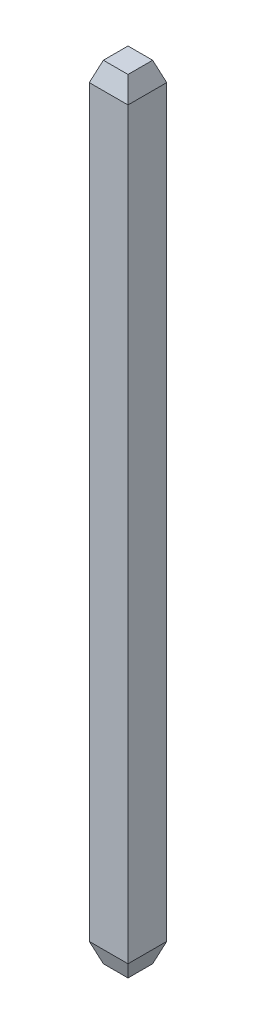
ISO-10303-21;
HEADER;
FILE_DESCRIPTION(('STEP AP214'),'2;1');
FILE_NAME('part.step','',(''),(''),'','','');
FILE_SCHEMA(('AUTOMOTIVE_DESIGN { 1 0 10303 214 1 1 1 1 }'));
ENDSEC;
DATA;
#1=APPLICATION_CONTEXT('core data for automotive mechanical design processes');
#2=APPLICATION_PROTOCOL_DEFINITION('international standard','automotive_design',2000,#1);
#3=PRODUCT_CONTEXT('',#1,'mechanical');
#4=PRODUCT('Part','Part','',(#3));
#5=PRODUCT_RELATED_PRODUCT_CATEGORY('part','',(#4));
#6=PRODUCT_DEFINITION_FORMATION('','',#4);
#7=PRODUCT_DEFINITION_CONTEXT('part definition',#1,'design');
#8=PRODUCT_DEFINITION('design','',#6,#7);
#9=PRODUCT_DEFINITION_SHAPE('','',#8);
#10=(LENGTH_UNIT() NAMED_UNIT(*) SI_UNIT(.MILLI.,.METRE.));
#11=(NAMED_UNIT(*) PLANE_ANGLE_UNIT() SI_UNIT($,.RADIAN.));
#12=(NAMED_UNIT(*) SI_UNIT($,.STERADIAN.) SOLID_ANGLE_UNIT());
#13=UNCERTAINTY_MEASURE_WITH_UNIT(LENGTH_MEASURE(1.E-05),#10,'distance_accuracy_value','');
#14=(GEOMETRIC_REPRESENTATION_CONTEXT(3) GLOBAL_UNCERTAINTY_ASSIGNED_CONTEXT((#13)) GLOBAL_UNIT_ASSIGNED_CONTEXT((#10,
#11,#12)) REPRESENTATION_CONTEXT('',''));
#15=CARTESIAN_POINT('',(0.,0.,0.));
#16=DIRECTION('',(0.,0.,1.));
#17=DIRECTION('',(1.,0.,0.));
#18=AXIS2_PLACEMENT_3D('',#15,#16,#17);
#19=CARTESIAN_POINT('',(12.7,4.1,-7.37));
#20=DIRECTION('',(0.,0.,-1.));
#21=DIRECTION('',(0.,-1.,0.));
#22=AXIS2_PLACEMENT_3D('',#19,#20,#21);
#23=PLANE('',#22);
#24=DIRECTION('',(-1.,0.,0.));
#25=VECTOR('',#24,1.);
#26=CARTESIAN_POINT('',(12.7,-5.75,-7.37));
#27=LINE('',#26,#25);
#28=CARTESIAN_POINT('',(-4.83,-5.75,-7.37));
#29=VERTEX_POINT('',#28);
#30=CARTESIAN_POINT('',(-5.33,-5.75,-7.37));
#31=VERTEX_POINT('',#30);
#32=EDGE_CURVE('E11',#29,#31,#27,.T.);
#33=ORIENTED_EDGE('',*,*,#32,.F.);
#34=DIRECTION('',(0.,-1.,0.));
#35=VECTOR('',#34,1.);
#36=CARTESIAN_POINT('',(-4.83,4.1,-7.37));
#37=LINE('',#36,#35);
#38=CARTESIAN_POINT('',(-4.83,3.85,-7.37));
#39=VERTEX_POINT('',#38);
#40=EDGE_CURVE('E24',#39,#29,#37,.T.);
#41=ORIENTED_EDGE('',*,*,#40,.F.);
#42=DIRECTION('',(1.,0.,0.));
#43=VECTOR('',#42,1.);
#44=CARTESIAN_POINT('',(12.7,3.85,-7.37));
#45=LINE('',#44,#43);
#46=CARTESIAN_POINT('',(-5.33,3.85,-7.37));
#47=VERTEX_POINT('',#46);
#48=EDGE_CURVE('E158',#47,#39,#45,.T.);
#49=ORIENTED_EDGE('',*,*,#48,.F.);
#50=DIRECTION('',(0.,1.,0.));
#51=VECTOR('',#50,1.);
#52=CARTESIAN_POINT('',(-5.33,4.1,-7.37));
#53=LINE('',#52,#51);
#54=EDGE_CURVE('E155',#31,#47,#53,.T.);
#55=ORIENTED_EDGE('',*,*,#54,.F.);
#56=EDGE_LOOP('',(#33,#41,#49,#55));
#57=FACE_BOUND('',#56,.T.);
#58=ADVANCED_FACE('F17',(#57),#23,.F.);
#59=CARTESIAN_POINT('',(-5.33,4.1,0.));
#60=DIRECTION('',(-1.,0.,0.));
#61=DIRECTION('',(0.,0.,1.));
#62=AXIS2_PLACEMENT_3D('',#59,#60,#61);
#63=PLANE('',#62);
#64=ORIENTED_EDGE('',*,*,#54,.T.);
#65=DIRECTION('',(0.,0.,-1.));
#66=VECTOR('',#65,1.);
#67=CARTESIAN_POINT('',(-5.33,3.85,0.));
#68=LINE('',#67,#66);
#69=CARTESIAN_POINT('',(-5.33,3.85,-7.87));
#70=VERTEX_POINT('',#69);
#71=EDGE_CURVE('E153',#47,#70,#68,.T.);
#72=ORIENTED_EDGE('',*,*,#71,.T.);
#73=DIRECTION('',(0.,-1.,0.));
#74=VECTOR('',#73,1.);
#75=CARTESIAN_POINT('',(-5.33,4.1,-7.87));
#76=LINE('',#75,#74);
#77=CARTESIAN_POINT('',(-5.33,-5.75,-7.87));
#78=VERTEX_POINT('',#77);
#79=EDGE_CURVE('E151',#70,#78,#76,.T.);
#80=ORIENTED_EDGE('',*,*,#79,.T.);
#81=DIRECTION('',(0.,0.,1.));
#82=VECTOR('',#81,1.);
#83=CARTESIAN_POINT('',(-5.33,-5.75,0.));
#84=LINE('',#83,#82);
#85=EDGE_CURVE('E148',#78,#31,#84,.T.);
#86=ORIENTED_EDGE('',*,*,#85,.T.);
#87=EDGE_LOOP('',(#64,#72,#80,#86));
#88=FACE_BOUND('',#87,.T.);
#89=ADVANCED_FACE('F182',(#88),#63,.T.);
#90=CARTESIAN_POINT('',(12.7,-6.,-7.46099255856655));
#91=DIRECTION('',(0.,0.342020143325665,-0.93969262078591));
#92=DIRECTION('',(-1.,0.,0.));
#93=AXIS2_PLACEMENT_3D('',#90,#91,#92);
#94=PLANE('',#93);
#95=DIRECTION('',(-1.,0.,0.));
#96=VECTOR('',#95,1.);
#97=CARTESIAN_POINT('',(12.7,-6.,-7.46099255856655));
#98=LINE('',#97,#96);
#99=CARTESIAN_POINT('',(-4.92099255856655,-6.,-7.46099255856655));
#100=VERTEX_POINT('',#99);
#101=CARTESIAN_POINT('',(-5.23900744143345,-6.,-7.46099255856655));
#102=VERTEX_POINT('',#101);
#103=EDGE_CURVE('E146',#100,#102,#98,.T.);
#104=ORIENTED_EDGE('',*,*,#103,.F.);
#105=DIRECTION('',(-0.323615577118173,-0.889126490715994,-0.323615577118182));
#106=VECTOR('',#105,1.);
#107=CARTESIAN_POINT('',(-4.83,-5.75,-7.37));
#108=LINE('',#107,#106);
#109=EDGE_CURVE('E143',#29,#100,#108,.T.);
#110=ORIENTED_EDGE('',*,*,#109,.F.);
#111=ORIENTED_EDGE('',*,*,#32,.T.);
#112=DIRECTION('',(-0.323615577118173,0.889126490715994,0.323615577118182));
#113=VECTOR('',#112,1.);
#114=CARTESIAN_POINT('',(-5.23900744143345,-6.,-7.46099255856655));
#115=LINE('',#114,#113);
#116=EDGE_CURVE('E140',#102,#31,#115,.T.);
#117=ORIENTED_EDGE('',*,*,#116,.F.);
#118=EDGE_LOOP('',(#104,#110,#111,#117));
#119=FACE_BOUND('',#118,.T.);
#120=ADVANCED_FACE('F162',(#119),#94,.F.);
#121=CARTESIAN_POINT('',(-4.83,4.1,0.));
#122=DIRECTION('',(-1.,0.,0.));
#123=DIRECTION('',(0.,0.,1.));
#124=AXIS2_PLACEMENT_3D('',#121,#122,#123);
#125=PLANE('',#124);
#126=DIRECTION('',(0.,0.,1.));
#127=VECTOR('',#126,1.);
#128=CARTESIAN_POINT('',(-4.83,-5.75,0.));
#129=LINE('',#128,#127);
#130=CARTESIAN_POINT('',(-4.83,-5.75,-7.87));
#131=VERTEX_POINT('',#130);
#132=EDGE_CURVE('E137',#131,#29,#129,.T.);
#133=ORIENTED_EDGE('',*,*,#132,.F.);
#134=DIRECTION('',(0.,-1.,0.));
#135=VECTOR('',#134,1.);
#136=CARTESIAN_POINT('',(-4.83,4.1,-7.87));
#137=LINE('',#136,#135);
#138=CARTESIAN_POINT('',(-4.83,3.85,-7.87));
#139=VERTEX_POINT('',#138);
#140=EDGE_CURVE('E134',#139,#131,#137,.T.);
#141=ORIENTED_EDGE('',*,*,#140,.F.);
#142=DIRECTION('',(0.,0.,-1.));
#143=VECTOR('',#142,1.);
#144=CARTESIAN_POINT('',(-4.83,3.85,0.));
#145=LINE('',#144,#143);
#146=EDGE_CURVE('E85',#39,#139,#145,.T.);
#147=ORIENTED_EDGE('',*,*,#146,.F.);
#148=ORIENTED_EDGE('',*,*,#40,.T.);
#149=EDGE_LOOP('',(#133,#141,#147,#148));
#150=FACE_BOUND('',#149,.T.);
#151=ADVANCED_FACE('F161',(#150),#125,.F.);
#152=CARTESIAN_POINT('',(12.7,4.1,-7.46099255856655));
#153=DIRECTION('',(0.,0.342020143325666,0.939692620785909));
#154=DIRECTION('',(1.,0.,0.));
#155=AXIS2_PLACEMENT_3D('',#152,#153,#154);
#156=PLANE('',#155);
#157=DIRECTION('',(-0.323615577118177,-0.889126490715991,0.323615577118183));
#158=VECTOR('',#157,1.);
#159=CARTESIAN_POINT('',(-5.23900744143345,4.1,-7.46099255856655));
#160=LINE('',#159,#158);
#161=CARTESIAN_POINT('',(-5.23900744143345,4.1,-7.46099255856655));
#162=VERTEX_POINT('',#161);
#163=EDGE_CURVE('E130',#162,#47,#160,.T.);
#164=ORIENTED_EDGE('',*,*,#163,.T.);
#165=ORIENTED_EDGE('',*,*,#48,.T.);
#166=DIRECTION('',(-0.323615577118177,0.889126490715991,-0.323615577118183));
#167=VECTOR('',#166,1.);
#168=CARTESIAN_POINT('',(-4.83,3.85,-7.37));
#169=LINE('',#168,#167);
#170=CARTESIAN_POINT('',(-4.92099255856655,4.1,-7.46099255856655));
#171=VERTEX_POINT('',#170);
#172=EDGE_CURVE('E128',#39,#171,#169,.T.);
#173=ORIENTED_EDGE('',*,*,#172,.T.);
#174=DIRECTION('',(-1.,0.,0.));
#175=VECTOR('',#174,1.);
#176=CARTESIAN_POINT('',(12.7,4.1,-7.46099255856655));
#177=LINE('',#176,#175);
#178=EDGE_CURVE('E99',#171,#162,#177,.T.);
#179=ORIENTED_EDGE('',*,*,#178,.T.);
#180=EDGE_LOOP('',(#164,#165,#173,#179));
#181=FACE_BOUND('',#180,.T.);
#182=ADVANCED_FACE('F181',(#181),#156,.T.);
#183=CARTESIAN_POINT('',(-5.33,3.85,0.));
#184=DIRECTION('',(0.939692620785912,-0.34202014332566,0.));
#185=DIRECTION('',(0.,0.,-1.));
#186=AXIS2_PLACEMENT_3D('',#183,#184,#185);
#187=PLANE('',#186);
#188=DIRECTION('',(0.,0.,1.));
#189=VECTOR('',#188,1.);
#190=CARTESIAN_POINT('',(-5.23900744143345,4.1,0.));
#191=LINE('',#190,#189);
#192=CARTESIAN_POINT('',(-5.23900744143345,4.1,-7.77900744143345));
#193=VERTEX_POINT('',#192);
#194=EDGE_CURVE('E125',#193,#162,#191,.T.);
#195=ORIENTED_EDGE('',*,*,#194,.F.);
#196=DIRECTION('',(0.323615577118177,0.889126490715992,0.323615577118183));
#197=VECTOR('',#196,1.);
#198=CARTESIAN_POINT('',(-5.33,3.85,-7.87));
#199=LINE('',#198,#197);
#200=EDGE_CURVE('E104',#70,#193,#199,.T.);
#201=ORIENTED_EDGE('',*,*,#200,.F.);
#202=ORIENTED_EDGE('',*,*,#71,.F.);
#203=ORIENTED_EDGE('',*,*,#163,.F.);
#204=EDGE_LOOP('',(#195,#201,#202,#203));
#205=FACE_BOUND('',#204,.T.);
#206=ADVANCED_FACE('F179',(#205),#187,.F.);
#207=CARTESIAN_POINT('',(-5.33,-5.75,0.));
#208=DIRECTION('',(-0.939692620785912,-0.342020143325659,0.));
#209=DIRECTION('',(-0.342020143325659,0.939692620785912,0.));
#210=AXIS2_PLACEMENT_3D('',#207,#208,#209);
#211=PLANE('',#210);
#212=DIRECTION('',(0.323615577118175,-0.889126490715994,0.323615577118179));
#213=VECTOR('',#212,1.);
#214=CARTESIAN_POINT('',(-5.33,-5.75,-7.87));
#215=LINE('',#214,#213);
#216=CARTESIAN_POINT('',(-5.23900744143345,-6.,-7.77900744143345));
#217=VERTEX_POINT('',#216);
#218=EDGE_CURVE('E122',#78,#217,#215,.T.);
#219=ORIENTED_EDGE('',*,*,#218,.T.);
#220=DIRECTION('',(0.,0.,1.));
#221=VECTOR('',#220,1.);
#222=CARTESIAN_POINT('',(-5.23900744143345,-6.,0.));
#223=LINE('',#222,#221);
#224=EDGE_CURVE('E119',#217,#102,#223,.T.);
#225=ORIENTED_EDGE('',*,*,#224,.T.);
#226=ORIENTED_EDGE('',*,*,#116,.T.);
#227=ORIENTED_EDGE('',*,*,#85,.F.);
#228=EDGE_LOOP('',(#219,#225,#226,#227));
#229=FACE_BOUND('',#228,.T.);
#230=ADVANCED_FACE('F184',(#229),#211,.T.);
#231=CARTESIAN_POINT('',(12.7,4.1,-7.87));
#232=DIRECTION('',(0.,0.,-1.));
#233=DIRECTION('',(0.,-1.,0.));
#234=AXIS2_PLACEMENT_3D('',#231,#232,#233);
#235=PLANE('',#234);
#236=ORIENTED_EDGE('',*,*,#79,.F.);
#237=DIRECTION('',(1.,0.,0.));
#238=VECTOR('',#237,1.);
#239=CARTESIAN_POINT('',(12.7,3.85,-7.87));
#240=LINE('',#239,#238);
#241=EDGE_CURVE('E117',#70,#139,#240,.T.);
#242=ORIENTED_EDGE('',*,*,#241,.T.);
#243=ORIENTED_EDGE('',*,*,#140,.T.);
#244=DIRECTION('',(-1.,0.,0.));
#245=VECTOR('',#244,1.);
#246=CARTESIAN_POINT('',(12.7,-5.75,-7.87));
#247=LINE('',#246,#245);
#248=EDGE_CURVE('E114',#131,#78,#247,.T.);
#249=ORIENTED_EDGE('',*,*,#248,.T.);
#250=EDGE_LOOP('',(#236,#242,#243,#249));
#251=FACE_BOUND('',#250,.T.);
#252=ADVANCED_FACE('F174',(#251),#235,.T.);
#253=CARTESIAN_POINT('',(12.7,-6.,0.));
#254=DIRECTION('',(0.,1.,0.));
#255=DIRECTION('',(1.,0.,0.));
#256=AXIS2_PLACEMENT_3D('',#253,#254,#255);
#257=PLANE('',#256);
#258=DIRECTION('',(0.,0.,-1.));
#259=VECTOR('',#258,1.);
#260=CARTESIAN_POINT('',(-4.92099255856655,-6.,0.));
#261=LINE('',#260,#259);
#262=CARTESIAN_POINT('',(-4.92099255856655,-6.,-7.77900744143345));
#263=VERTEX_POINT('',#262);
#264=EDGE_CURVE('E112',#100,#263,#261,.T.);
#265=ORIENTED_EDGE('',*,*,#264,.F.);
#266=ORIENTED_EDGE('',*,*,#103,.T.);
#267=ORIENTED_EDGE('',*,*,#224,.F.);
#268=DIRECTION('',(-1.,0.,0.));
#269=VECTOR('',#268,1.);
#270=CARTESIAN_POINT('',(12.7,-6.,-7.77900744143345));
#271=LINE('',#270,#269);
#272=EDGE_CURVE('E109',#263,#217,#271,.T.);
#273=ORIENTED_EDGE('',*,*,#272,.F.);
#274=EDGE_LOOP('',(#265,#266,#267,#273));
#275=FACE_BOUND('',#274,.T.);
#276=ADVANCED_FACE('F187',(#275),#257,.F.);
#277=CARTESIAN_POINT('',(-4.92099255856655,-6.,0.));
#278=DIRECTION('',(-0.939692620785912,0.342020143325659,0.));
#279=DIRECTION('',(0.,0.,1.));
#280=AXIS2_PLACEMENT_3D('',#277,#278,#279);
#281=PLANE('',#280);
#282=ORIENTED_EDGE('',*,*,#132,.T.);
#283=ORIENTED_EDGE('',*,*,#109,.T.);
#284=ORIENTED_EDGE('',*,*,#264,.T.);
#285=DIRECTION('',(-0.323615577118175,-0.889126490715994,0.323615577118179));
#286=VECTOR('',#285,1.);
#287=CARTESIAN_POINT('',(-4.83,-5.75,-7.87));
#288=LINE('',#287,#286);
#289=EDGE_CURVE('E90',#131,#263,#288,.T.);
#290=ORIENTED_EDGE('',*,*,#289,.F.);
#291=EDGE_LOOP('',(#282,#283,#284,#290));
#292=FACE_BOUND('',#291,.T.);
#293=ADVANCED_FACE('F166',(#292),#281,.F.);
#294=CARTESIAN_POINT('',(-4.92099255856655,4.1,0.));
#295=DIRECTION('',(0.939692620785912,0.34202014332566,0.));
#296=DIRECTION('',(0.,0.,-1.));
#297=AXIS2_PLACEMENT_3D('',#294,#295,#296);
#298=PLANE('',#297);
#299=ORIENTED_EDGE('',*,*,#172,.F.);
#300=ORIENTED_EDGE('',*,*,#146,.T.);
#301=DIRECTION('',(-0.323615577118177,0.889126490715992,0.323615577118183));
#302=VECTOR('',#301,1.);
#303=CARTESIAN_POINT('',(-4.83,3.85,-7.87));
#304=LINE('',#303,#302);
#305=CARTESIAN_POINT('',(-4.92099255856655,4.1,-7.77900744143345));
#306=VERTEX_POINT('',#305);
#307=EDGE_CURVE('E79',#139,#306,#304,.T.);
#308=ORIENTED_EDGE('',*,*,#307,.T.);
#309=DIRECTION('',(0.,0.,1.));
#310=VECTOR('',#309,1.);
#311=CARTESIAN_POINT('',(-4.92099255856655,4.1,0.));
#312=LINE('',#311,#310);
#313=EDGE_CURVE('E83',#306,#171,#312,.T.);
#314=ORIENTED_EDGE('',*,*,#313,.T.);
#315=EDGE_LOOP('',(#299,#300,#308,#314));
#316=FACE_BOUND('',#315,.T.);
#317=ADVANCED_FACE('F82',(#316),#298,.T.);
#318=CARTESIAN_POINT('',(12.7,4.1,0.));
#319=DIRECTION('',(0.,1.,0.));
#320=DIRECTION('',(1.,0.,0.));
#321=AXIS2_PLACEMENT_3D('',#318,#319,#320);
#322=PLANE('',#321);
#323=ORIENTED_EDGE('',*,*,#178,.F.);
#324=ORIENTED_EDGE('',*,*,#313,.F.);
#325=DIRECTION('',(-1.,0.,0.));
#326=VECTOR('',#325,1.);
#327=CARTESIAN_POINT('',(12.7,4.1,-7.77900744143345));
#328=LINE('',#327,#326);
#329=EDGE_CURVE('E97',#306,#193,#328,.T.);
#330=ORIENTED_EDGE('',*,*,#329,.T.);
#331=ORIENTED_EDGE('',*,*,#194,.T.);
#332=EDGE_LOOP('',(#323,#324,#330,#331));
#333=FACE_BOUND('',#332,.T.);
#334=ADVANCED_FACE('F95',(#333),#322,.T.);
#335=CARTESIAN_POINT('',(12.7,3.85,-7.87));
#336=DIRECTION('',(0.,-0.342020143325666,0.939692620785909));
#337=DIRECTION('',(-1.,0.,0.));
#338=AXIS2_PLACEMENT_3D('',#335,#336,#337);
#339=PLANE('',#338);
#340=ORIENTED_EDGE('',*,*,#241,.F.);
#341=ORIENTED_EDGE('',*,*,#200,.T.);
#342=ORIENTED_EDGE('',*,*,#329,.F.);
#343=ORIENTED_EDGE('',*,*,#307,.F.);
#344=EDGE_LOOP('',(#340,#341,#342,#343));
#345=FACE_BOUND('',#344,.T.);
#346=ADVANCED_FACE('F102',(#345),#339,.F.);
#347=CARTESIAN_POINT('',(12.7,-5.75,-7.87));
#348=DIRECTION('',(0.,-0.342020143325665,-0.93969262078591));
#349=DIRECTION('',(0.,-0.93969262078591,0.342020143325665));
#350=AXIS2_PLACEMENT_3D('',#347,#348,#349);
#351=PLANE('',#350);
#352=ORIENTED_EDGE('',*,*,#289,.T.);
#353=ORIENTED_EDGE('',*,*,#272,.T.);
#354=ORIENTED_EDGE('',*,*,#218,.F.);
#355=ORIENTED_EDGE('',*,*,#248,.F.);
#356=EDGE_LOOP('',(#352,#353,#354,#355));
#357=FACE_BOUND('',#356,.T.);
#358=ADVANCED_FACE('F170',(#357),#351,.T.);
#359=CLOSED_SHELL('',(#58,#89,#120,#151,#182,#206,#230,#252,#276,#293,#317,#334,#346,#358));
#360=MANIFOLD_SOLID_BREP('B1',#359);
#361=ADVANCED_BREP_SHAPE_REPRESENTATION('',(#18,#360),#14);
#362=SHAPE_DEFINITION_REPRESENTATION(#9,#361);
ENDSEC;
END-ISO-10303-21;
